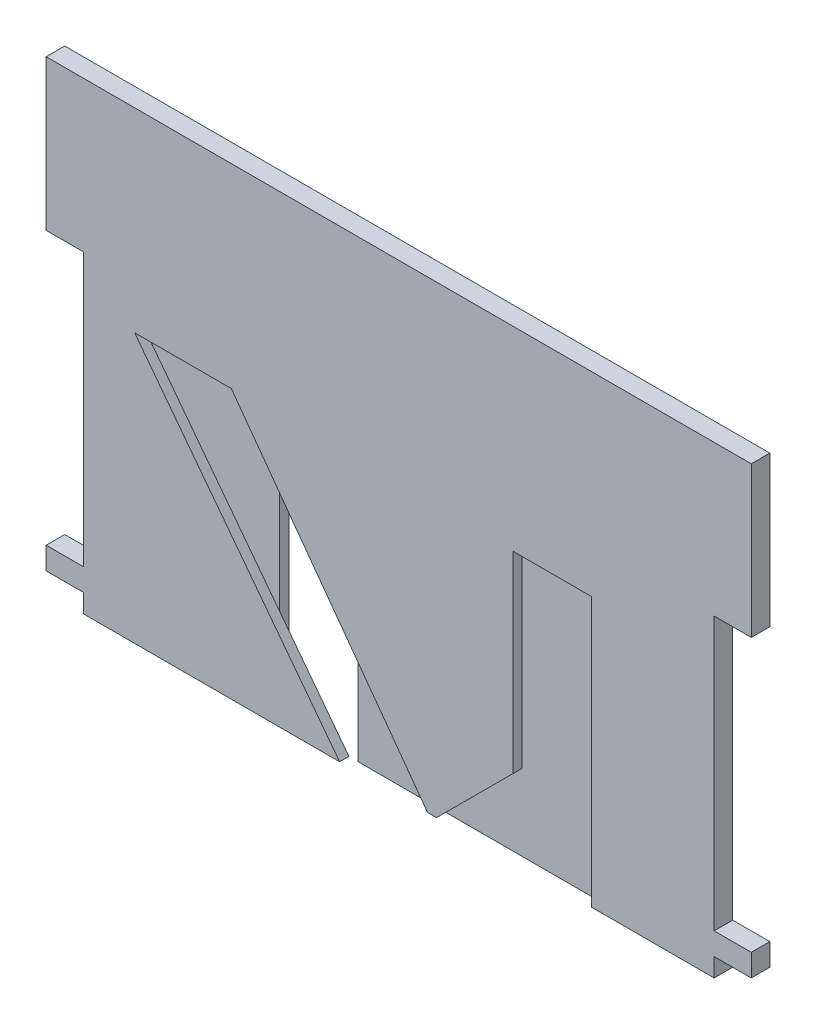
ISO-10303-21;
HEADER;
FILE_DESCRIPTION(('STEP AP214'),'2;1');
FILE_NAME('part.step','',(''),(''),'','','');
FILE_SCHEMA(('AUTOMOTIVE_DESIGN { 1 0 10303 214 1 1 1 1 }'));
ENDSEC;
DATA;
#1=APPLICATION_CONTEXT('core data for automotive mechanical design processes');
#2=APPLICATION_PROTOCOL_DEFINITION('international standard','automotive_design',2000,#1);
#3=PRODUCT_CONTEXT('',#1,'mechanical');
#4=PRODUCT('Part','Part','',(#3));
#5=PRODUCT_RELATED_PRODUCT_CATEGORY('part','',(#4));
#6=PRODUCT_DEFINITION_FORMATION('','',#4);
#7=PRODUCT_DEFINITION_CONTEXT('part definition',#1,'design');
#8=PRODUCT_DEFINITION('design','',#6,#7);
#9=PRODUCT_DEFINITION_SHAPE('','',#8);
#10=(LENGTH_UNIT() NAMED_UNIT(*) SI_UNIT(.MILLI.,.METRE.));
#11=(NAMED_UNIT(*) PLANE_ANGLE_UNIT() SI_UNIT($,.RADIAN.));
#12=(NAMED_UNIT(*) SI_UNIT($,.STERADIAN.) SOLID_ANGLE_UNIT());
#13=UNCERTAINTY_MEASURE_WITH_UNIT(LENGTH_MEASURE(1.E-05),#10,'distance_accuracy_value','');
#14=(GEOMETRIC_REPRESENTATION_CONTEXT(3) GLOBAL_UNCERTAINTY_ASSIGNED_CONTEXT((#13)) GLOBAL_UNIT_ASSIGNED_CONTEXT((#10,
#11,#12)) REPRESENTATION_CONTEXT('',''));
#15=CARTESIAN_POINT('',(0.,0.,0.));
#16=DIRECTION('',(0.,0.,1.));
#17=DIRECTION('',(1.,0.,0.));
#18=AXIS2_PLACEMENT_3D('',#15,#16,#17);
#19=CARTESIAN_POINT('',(7.42992576682308,-12.9952354620521,0.5));
#20=DIRECTION('',(0.,0.,-1.));
#21=DIRECTION('',(-1.,0.,0.));
#22=AXIS2_PLACEMENT_3D('',#19,#20,#21);
#23=PLANE('',#22);
#24=DIRECTION('',(-0.606026720954855,0.795444286854024,0.));
#25=VECTOR('',#24,1.);
#26=CARTESIAN_POINT('',(-0.925480769230772,-2.46394230769231,0.5));
#27=LINE('',#26,#25);
#28=CARTESIAN_POINT('',(-3.18362539043888,0.5,0.5));
#29=VERTEX_POINT('',#28);
#30=CARTESIAN_POINT('',(-6.92307692307691,5.40824126189978,0.5));
#31=VERTEX_POINT('',#30);
#32=EDGE_CURVE('E452',#29,#31,#27,.T.);
#33=ORIENTED_EDGE('',*,*,#32,.F.);
#34=DIRECTION('',(-1.,0.,0.));
#35=VECTOR('',#34,1.);
#36=CARTESIAN_POINT('',(-17.,0.5,0.5));
#37=LINE('',#36,#35);
#38=CARTESIAN_POINT('',(-6.92307692307691,0.5,0.5));
#39=VERTEX_POINT('',#38);
#40=EDGE_CURVE('E257',#29,#39,#37,.T.);
#41=ORIENTED_EDGE('',*,*,#40,.T.);
#42=DIRECTION('',(0.,-1.,0.));
#43=VECTOR('',#42,1.);
#44=CARTESIAN_POINT('',(-6.92307692307691,15.,0.5));
#45=LINE('',#44,#43);
#46=EDGE_CURVE('E408',#31,#39,#45,.T.);
#47=ORIENTED_EDGE('',*,*,#46,.F.);
#48=EDGE_LOOP('',(#33,#41,#47));
#49=FACE_BOUND('',#48,.T.);
#50=ADVANCED_FACE('F39',(#49),#23,.T.);
#51=CARTESIAN_POINT('',(-17.,0.5,1.));
#52=DIRECTION('',(0.,1.,0.));
#53=DIRECTION('',(0.,0.,1.));
#54=AXIS2_PLACEMENT_3D('',#51,#52,#53);
#55=PLANE('',#54);
#56=DIRECTION('',(0.,0.,-1.));
#57=VECTOR('',#56,1.);
#58=CARTESIAN_POINT('',(-3.18362539043888,0.5,1.));
#59=LINE('',#58,#57);
#60=CARTESIAN_POINT('',(-3.18362539043888,0.5,1.));
#61=VERTEX_POINT('',#60);
#62=EDGE_CURVE('E11',#61,#29,#59,.T.);
#63=ORIENTED_EDGE('',*,*,#62,.F.);
#64=DIRECTION('',(1.,0.,0.));
#65=VECTOR('',#64,1.);
#66=CARTESIAN_POINT('',(-17.,0.5,1.));
#67=LINE('',#66,#65);
#68=CARTESIAN_POINT('',(-17.,0.5,1.));
#69=VERTEX_POINT('',#68);
#70=EDGE_CURVE('E226',#69,#61,#67,.T.);
#71=ORIENTED_EDGE('',*,*,#70,.F.);
#72=DIRECTION('',(0.,0.,-1.));
#73=VECTOR('',#72,1.);
#74=CARTESIAN_POINT('',(-17.,0.5,1.));
#75=LINE('',#74,#73);
#76=CARTESIAN_POINT('',(-17.,0.5,0.));
#77=VERTEX_POINT('',#76);
#78=EDGE_CURVE('E275',#69,#77,#75,.T.);
#79=ORIENTED_EDGE('',*,*,#78,.T.);
#80=DIRECTION('',(1.,0.,0.));
#81=VECTOR('',#80,1.);
#82=CARTESIAN_POINT('',(-17.,0.5,0.));
#83=LINE('',#82,#81);
#84=CARTESIAN_POINT('',(-6.92307692307691,0.5,0.));
#85=VERTEX_POINT('',#84);
#86=EDGE_CURVE('E319',#77,#85,#83,.T.);
#87=ORIENTED_EDGE('',*,*,#86,.T.);
#88=DIRECTION('',(0.,0.,-1.));
#89=VECTOR('',#88,1.);
#90=CARTESIAN_POINT('',(-6.92307692307691,0.5,1.));
#91=LINE('',#90,#89);
#92=EDGE_CURVE('E188',#39,#85,#91,.T.);
#93=ORIENTED_EDGE('',*,*,#92,.F.);
#94=ORIENTED_EDGE('',*,*,#40,.F.);
#95=EDGE_LOOP('',(#63,#71,#79,#87,#93,#94));
#96=FACE_BOUND('',#95,.T.);
#97=ADVANCED_FACE('F366',(#96),#55,.F.);
#98=DIRECTION('',(0.,0.,1.));
#99=VECTOR('',#98,1.);
#100=CARTESIAN_POINT('',(10.3846153846154,0.5,1.));
#101=LINE('',#100,#99);
#102=CARTESIAN_POINT('',(10.3846153846154,0.5,0.5));
#103=VERTEX_POINT('',#102);
#104=CARTESIAN_POINT('',(10.3846153846154,0.5,1.));
#105=VERTEX_POINT('',#104);
#106=EDGE_CURVE('E47',#103,#105,#101,.T.);
#107=ORIENTED_EDGE('',*,*,#106,.F.);
#108=DIRECTION('',(-1.,0.,0.));
#109=VECTOR('',#108,1.);
#110=CARTESIAN_POINT('',(-17.,0.5,0.5));
#111=LINE('',#110,#109);
#112=CARTESIAN_POINT('',(2.0328317373461,0.5,0.5));
#113=VERTEX_POINT('',#112);
#114=EDGE_CURVE('E212',#103,#113,#111,.T.);
#115=ORIENTED_EDGE('',*,*,#114,.T.);
#116=DIRECTION('',(0.,0.,-1.));
#117=VECTOR('',#116,1.);
#118=CARTESIAN_POINT('',(2.0328317373461,0.5,1.));
#119=LINE('',#118,#117);
#120=CARTESIAN_POINT('',(2.0328317373461,0.5,1.));
#121=VERTEX_POINT('',#120);
#122=EDGE_CURVE('E265',#121,#113,#119,.T.);
#123=ORIENTED_EDGE('',*,*,#122,.F.);
#124=CARTESIAN_POINT('',(1.55236112631776,0.5,1.));
#125=VERTEX_POINT('',#124);
#126=EDGE_CURVE('E229',#125,#121,#67,.T.);
#127=ORIENTED_EDGE('',*,*,#126,.F.);
#128=DIRECTION('',(0.,0.,1.));
#129=VECTOR('',#128,1.);
#130=CARTESIAN_POINT('',(1.55236112631776,0.5,1.));
#131=LINE('',#130,#129);
#132=CARTESIAN_POINT('',(1.55236112631776,0.5,0.5));
#133=VERTEX_POINT('',#132);
#134=EDGE_CURVE('E259',#133,#125,#131,.T.);
#135=ORIENTED_EDGE('',*,*,#134,.F.);
#136=CARTESIAN_POINT('',(-2.69230769230768,0.5,0.5));
#137=VERTEX_POINT('',#136);
#138=EDGE_CURVE('E214',#133,#137,#111,.T.);
#139=ORIENTED_EDGE('',*,*,#138,.T.);
#140=DIRECTION('',(0.,0.,1.));
#141=VECTOR('',#140,1.);
#142=CARTESIAN_POINT('',(-2.69230769230768,0.5,1.));
#143=LINE('',#142,#141);
#144=CARTESIAN_POINT('',(-2.69230769230768,0.5,0.));
#145=VERTEX_POINT('',#144);
#146=EDGE_CURVE('E315',#145,#137,#143,.T.);
#147=ORIENTED_EDGE('',*,*,#146,.F.);
#148=DIRECTION('',(1.,0.,0.));
#149=VECTOR('',#148,1.);
#150=CARTESIAN_POINT('',(-17.,0.5,0.));
#151=LINE('',#150,#149);
#152=CARTESIAN_POINT('',(17.,0.5,0.));
#153=VERTEX_POINT('',#152);
#154=EDGE_CURVE('E318',#145,#153,#151,.T.);
#155=ORIENTED_EDGE('',*,*,#154,.T.);
#156=DIRECTION('',(0.,0.,-1.));
#157=VECTOR('',#156,1.);
#158=CARTESIAN_POINT('',(17.,0.5,1.));
#159=LINE('',#158,#157);
#160=CARTESIAN_POINT('',(17.,0.5,1.));
#161=VERTEX_POINT('',#160);
#162=EDGE_CURVE('E274',#161,#153,#159,.T.);
#163=ORIENTED_EDGE('',*,*,#162,.F.);
#164=EDGE_CURVE('E224',#105,#161,#67,.T.);
#165=ORIENTED_EDGE('',*,*,#164,.F.);
#166=EDGE_LOOP('',(#107,#115,#123,#127,#135,#139,#147,#155,#163,#165));
#167=FACE_BOUND('',#166,.T.);
#168=ADVANCED_FACE('F373',(#167),#55,.F.);
#169=CARTESIAN_POINT('',(0.,0.,0.));
#170=DIRECTION('',(0.,0.,-1.));
#171=DIRECTION('',(-1.,0.,0.));
#172=AXIS2_PLACEMENT_3D('',#169,#170,#171);
#173=PLANE('',#172);
#174=DIRECTION('',(-1.,0.,0.));
#175=VECTOR('',#174,1.);
#176=CARTESIAN_POINT('',(-2.69230769230768,15.,0.));
#177=LINE('',#176,#175);
#178=CARTESIAN_POINT('',(-2.69230769230768,15.,0.));
#179=VERTEX_POINT('',#178);
#180=CARTESIAN_POINT('',(-6.92307692307691,15.,0.));
#181=VERTEX_POINT('',#180);
#182=EDGE_CURVE('E193',#179,#181,#177,.T.);
#183=ORIENTED_EDGE('',*,*,#182,.T.);
#184=DIRECTION('',(0.,-1.,0.));
#185=VECTOR('',#184,1.);
#186=CARTESIAN_POINT('',(-6.92307692307691,15.,0.));
#187=LINE('',#186,#185);
#188=EDGE_CURVE('E181',#181,#85,#187,.T.);
#189=ORIENTED_EDGE('',*,*,#188,.T.);
#190=ORIENTED_EDGE('',*,*,#86,.F.);
#191=DIRECTION('',(0.,1.,0.));
#192=VECTOR('',#191,1.);
#193=CARTESIAN_POINT('',(-17.,1.5,0.));
#194=LINE('',#193,#192);
#195=CARTESIAN_POINT('',(-17.,1.5,0.));
#196=VERTEX_POINT('',#195);
#197=EDGE_CURVE('E321',#196,#77,#194,.F.);
#198=ORIENTED_EDGE('',*,*,#197,.F.);
#199=DIRECTION('',(-1.,0.,0.));
#200=VECTOR('',#199,1.);
#201=CARTESIAN_POINT('',(-19.,1.5,0.));
#202=LINE('',#201,#200);
#203=CARTESIAN_POINT('',(-19.,1.5,0.));
#204=VERTEX_POINT('',#203);
#205=EDGE_CURVE('E43',#204,#196,#202,.F.);
#206=ORIENTED_EDGE('',*,*,#205,.F.);
#207=DIRECTION('',(0.,1.,0.));
#208=VECTOR('',#207,1.);
#209=CARTESIAN_POINT('',(-19.,2.7,0.));
#210=LINE('',#209,#208);
#211=CARTESIAN_POINT('',(-19.,2.7,0.));
#212=VERTEX_POINT('',#211);
#213=EDGE_CURVE('E123',#212,#204,#210,.F.);
#214=ORIENTED_EDGE('',*,*,#213,.F.);
#215=DIRECTION('',(1.,0.,0.));
#216=VECTOR('',#215,1.);
#217=CARTESIAN_POINT('',(-17.,2.7,0.));
#218=LINE('',#217,#216);
#219=CARTESIAN_POINT('',(-17.,2.7,0.));
#220=VERTEX_POINT('',#219);
#221=EDGE_CURVE('E324',#220,#212,#218,.F.);
#222=ORIENTED_EDGE('',*,*,#221,.F.);
#223=DIRECTION('',(0.,1.,0.));
#224=VECTOR('',#223,1.);
#225=CARTESIAN_POINT('',(-17.,17.3947217067352,0.));
#226=LINE('',#225,#224);
#227=CARTESIAN_POINT('',(-17.,17.3947217067352,0.));
#228=VERTEX_POINT('',#227);
#229=EDGE_CURVE('E330',#228,#220,#226,.F.);
#230=ORIENTED_EDGE('',*,*,#229,.F.);
#231=DIRECTION('',(1.,0.,0.));
#232=VECTOR('',#231,1.);
#233=CARTESIAN_POINT('',(-19.,17.3947217067352,0.));
#234=LINE('',#233,#232);
#235=CARTESIAN_POINT('',(-19.,17.3947217067352,0.));
#236=VERTEX_POINT('',#235);
#237=EDGE_CURVE('E326',#236,#228,#234,.T.);
#238=ORIENTED_EDGE('',*,*,#237,.F.);
#239=DIRECTION('',(0.,1.,0.));
#240=VECTOR('',#239,1.);
#241=CARTESIAN_POINT('',(-19.,25.5,0.));
#242=LINE('',#241,#240);
#243=CARTESIAN_POINT('',(-19.,25.5,0.));
#244=VERTEX_POINT('',#243);
#245=EDGE_CURVE('E332',#244,#236,#242,.F.);
#246=ORIENTED_EDGE('',*,*,#245,.F.);
#247=DIRECTION('',(1.,0.,0.));
#248=VECTOR('',#247,1.);
#249=CARTESIAN_POINT('',(19.,25.5,0.));
#250=LINE('',#249,#248);
#251=CARTESIAN_POINT('',(19.,25.5,0.));
#252=VERTEX_POINT('',#251);
#253=EDGE_CURVE('E335',#252,#244,#250,.F.);
#254=ORIENTED_EDGE('',*,*,#253,.F.);
#255=DIRECTION('',(0.,1.,0.));
#256=VECTOR('',#255,1.);
#257=CARTESIAN_POINT('',(19.,17.3947217067352,0.));
#258=LINE('',#257,#256);
#259=CARTESIAN_POINT('',(19.,17.3947217067352,0.));
#260=VERTEX_POINT('',#259);
#261=EDGE_CURVE('E333',#260,#252,#258,.T.);
#262=ORIENTED_EDGE('',*,*,#261,.F.);
#263=DIRECTION('',(1.,0.,0.));
#264=VECTOR('',#263,1.);
#265=CARTESIAN_POINT('',(17.,17.3947217067352,0.));
#266=LINE('',#265,#264);
#267=CARTESIAN_POINT('',(17.,17.3947217067352,0.));
#268=VERTEX_POINT('',#267);
#269=EDGE_CURVE('E340',#268,#260,#266,.T.);
#270=ORIENTED_EDGE('',*,*,#269,.F.);
#271=DIRECTION('',(0.,1.,0.));
#272=VECTOR('',#271,1.);
#273=CARTESIAN_POINT('',(17.,2.7,0.));
#274=LINE('',#273,#272);
#275=CARTESIAN_POINT('',(17.,2.7,0.));
#276=VERTEX_POINT('',#275);
#277=EDGE_CURVE('E339',#276,#268,#274,.T.);
#278=ORIENTED_EDGE('',*,*,#277,.F.);
#279=DIRECTION('',(1.,0.,0.));
#280=VECTOR('',#279,1.);
#281=CARTESIAN_POINT('',(19.,2.7,0.));
#282=LINE('',#281,#280);
#283=CARTESIAN_POINT('',(19.,2.7,0.));
#284=VERTEX_POINT('',#283);
#285=EDGE_CURVE('E342',#284,#276,#282,.F.);
#286=ORIENTED_EDGE('',*,*,#285,.F.);
#287=DIRECTION('',(0.,1.,0.));
#288=VECTOR('',#287,1.);
#289=CARTESIAN_POINT('',(19.,1.5,0.));
#290=LINE('',#289,#288);
#291=CARTESIAN_POINT('',(19.,1.5,0.));
#292=VERTEX_POINT('',#291);
#293=EDGE_CURVE('E345',#292,#284,#290,.T.);
#294=ORIENTED_EDGE('',*,*,#293,.F.);
#295=DIRECTION('',(-1.,0.,0.));
#296=VECTOR('',#295,1.);
#297=CARTESIAN_POINT('',(17.,1.5,0.));
#298=LINE('',#297,#296);
#299=CARTESIAN_POINT('',(17.,1.5,0.));
#300=VERTEX_POINT('',#299);
#301=EDGE_CURVE('E343',#300,#292,#298,.F.);
#302=ORIENTED_EDGE('',*,*,#301,.F.);
#303=DIRECTION('',(0.,1.,0.));
#304=VECTOR('',#303,1.);
#305=CARTESIAN_POINT('',(17.,0.5,0.));
#306=LINE('',#305,#304);
#307=EDGE_CURVE('E322',#153,#300,#306,.T.);
#308=ORIENTED_EDGE('',*,*,#307,.F.);
#309=ORIENTED_EDGE('',*,*,#154,.F.);
#310=DIRECTION('',(0.,1.,0.));
#311=VECTOR('',#310,1.);
#312=CARTESIAN_POINT('',(-2.69230769230768,-5.63100961538462,0.));
#313=LINE('',#312,#311);
#314=EDGE_CURVE('E213',#145,#179,#313,.T.);
#315=ORIENTED_EDGE('',*,*,#314,.T.);
#316=EDGE_LOOP('',(#183,#189,#190,#198,#206,#214,#222,#230,#238,#246,#254,#262,#270,#278,#286,
#294,#302,#308,#309,#315));
#317=FACE_BOUND('',#316,.T.);
#318=ADVANCED_FACE('F206',(#317),#173,.T.);
#319=CARTESIAN_POINT('',(-19.,1.5,1.));
#320=DIRECTION('',(0.,1.,0.));
#321=DIRECTION('',(-1.,0.,0.));
#322=AXIS2_PLACEMENT_3D('',#319,#320,#321);
#323=PLANE('',#322);
#324=ORIENTED_EDGE('',*,*,#205,.T.);
#325=DIRECTION('',(0.,0.,-1.));
#326=VECTOR('',#325,1.);
#327=CARTESIAN_POINT('',(-17.,1.5,1.));
#328=LINE('',#327,#326);
#329=CARTESIAN_POINT('',(-17.,1.5,1.));
#330=VERTEX_POINT('',#329);
#331=EDGE_CURVE('E269',#330,#196,#328,.T.);
#332=ORIENTED_EDGE('',*,*,#331,.F.);
#333=DIRECTION('',(1.,0.,0.));
#334=VECTOR('',#333,1.);
#335=CARTESIAN_POINT('',(-19.,1.5,1.));
#336=LINE('',#335,#334);
#337=CARTESIAN_POINT('',(-19.,1.5,1.));
#338=VERTEX_POINT('',#337);
#339=EDGE_CURVE('E225',#338,#330,#336,.T.);
#340=ORIENTED_EDGE('',*,*,#339,.F.);
#341=DIRECTION('',(0.,0.,-1.));
#342=VECTOR('',#341,1.);
#343=CARTESIAN_POINT('',(-19.,1.5,1.));
#344=LINE('',#343,#342);
#345=EDGE_CURVE('E258',#338,#204,#344,.T.);
#346=ORIENTED_EDGE('',*,*,#345,.T.);
#347=EDGE_LOOP('',(#324,#332,#340,#346));
#348=FACE_BOUND('',#347,.T.);
#349=ADVANCED_FACE('F41',(#348),#323,.F.);
#350=CARTESIAN_POINT('',(-17.,1.5,1.));
#351=DIRECTION('',(1.,0.,0.));
#352=DIRECTION('',(0.,0.,-1.));
#353=AXIS2_PLACEMENT_3D('',#350,#351,#352);
#354=PLANE('',#353);
#355=ORIENTED_EDGE('',*,*,#197,.T.);
#356=ORIENTED_EDGE('',*,*,#78,.F.);
#357=DIRECTION('',(0.,-1.,0.));
#358=VECTOR('',#357,1.);
#359=CARTESIAN_POINT('',(-17.,1.5,1.));
#360=LINE('',#359,#358);
#361=EDGE_CURVE('E127',#330,#69,#360,.T.);
#362=ORIENTED_EDGE('',*,*,#361,.F.);
#363=ORIENTED_EDGE('',*,*,#331,.T.);
#364=EDGE_LOOP('',(#355,#356,#362,#363));
#365=FACE_BOUND('',#364,.T.);
#366=ADVANCED_FACE('F354',(#365),#354,.F.);
#367=CARTESIAN_POINT('',(17.,0.5,1.));
#368=DIRECTION('',(-1.,0.,0.));
#369=DIRECTION('',(0.,0.,1.));
#370=AXIS2_PLACEMENT_3D('',#367,#368,#369);
#371=PLANE('',#370);
#372=ORIENTED_EDGE('',*,*,#307,.T.);
#373=DIRECTION('',(0.,0.,-1.));
#374=VECTOR('',#373,1.);
#375=CARTESIAN_POINT('',(17.,1.5,1.));
#376=LINE('',#375,#374);
#377=CARTESIAN_POINT('',(17.,1.5,1.));
#378=VERTEX_POINT('',#377);
#379=EDGE_CURVE('E277',#378,#300,#376,.T.);
#380=ORIENTED_EDGE('',*,*,#379,.F.);
#381=DIRECTION('',(0.,1.,0.));
#382=VECTOR('',#381,1.);
#383=CARTESIAN_POINT('',(17.,0.5,1.));
#384=LINE('',#383,#382);
#385=EDGE_CURVE('E227',#161,#378,#384,.T.);
#386=ORIENTED_EDGE('',*,*,#385,.F.);
#387=ORIENTED_EDGE('',*,*,#162,.T.);
#388=EDGE_LOOP('',(#372,#380,#386,#387));
#389=FACE_BOUND('',#388,.T.);
#390=ADVANCED_FACE('F356',(#389),#371,.F.);
#391=CARTESIAN_POINT('',(17.,1.5,1.));
#392=DIRECTION('',(0.,1.,0.));
#393=DIRECTION('',(-1.,0.,0.));
#394=AXIS2_PLACEMENT_3D('',#391,#392,#393);
#395=PLANE('',#394);
#396=ORIENTED_EDGE('',*,*,#301,.T.);
#397=DIRECTION('',(0.,0.,-1.));
#398=VECTOR('',#397,1.);
#399=CARTESIAN_POINT('',(19.,1.5,1.));
#400=LINE('',#399,#398);
#401=CARTESIAN_POINT('',(19.,1.5,1.));
#402=VERTEX_POINT('',#401);
#403=EDGE_CURVE('E282',#402,#292,#400,.T.);
#404=ORIENTED_EDGE('',*,*,#403,.F.);
#405=DIRECTION('',(1.,0.,0.));
#406=VECTOR('',#405,1.);
#407=CARTESIAN_POINT('',(17.,1.5,1.));
#408=LINE('',#407,#406);
#409=EDGE_CURVE('E235',#378,#402,#408,.T.);
#410=ORIENTED_EDGE('',*,*,#409,.F.);
#411=ORIENTED_EDGE('',*,*,#379,.T.);
#412=EDGE_LOOP('',(#396,#404,#410,#411));
#413=FACE_BOUND('',#412,.T.);
#414=ADVANCED_FACE('F361',(#413),#395,.F.);
#415=CARTESIAN_POINT('',(19.,1.5,1.));
#416=DIRECTION('',(-1.,0.,0.));
#417=DIRECTION('',(0.,0.,1.));
#418=AXIS2_PLACEMENT_3D('',#415,#416,#417);
#419=PLANE('',#418);
#420=ORIENTED_EDGE('',*,*,#293,.T.);
#421=DIRECTION('',(0.,0.,-1.));
#422=VECTOR('',#421,1.);
#423=CARTESIAN_POINT('',(19.,2.7,1.));
#424=LINE('',#423,#422);
#425=CARTESIAN_POINT('',(19.,2.7,1.));
#426=VERTEX_POINT('',#425);
#427=EDGE_CURVE('E281',#426,#284,#424,.T.);
#428=ORIENTED_EDGE('',*,*,#427,.F.);
#429=DIRECTION('',(0.,1.,0.));
#430=VECTOR('',#429,1.);
#431=CARTESIAN_POINT('',(19.,1.5,1.));
#432=LINE('',#431,#430);
#433=EDGE_CURVE('E233',#402,#426,#432,.T.);
#434=ORIENTED_EDGE('',*,*,#433,.F.);
#435=ORIENTED_EDGE('',*,*,#403,.T.);
#436=EDGE_LOOP('',(#420,#428,#434,#435));
#437=FACE_BOUND('',#436,.T.);
#438=ADVANCED_FACE('F533',(#437),#419,.F.);
#439=CARTESIAN_POINT('',(19.,2.7,1.));
#440=DIRECTION('',(0.,-1.,0.));
#441=DIRECTION('',(0.,0.,-1.));
#442=AXIS2_PLACEMENT_3D('',#439,#440,#441);
#443=PLANE('',#442);
#444=ORIENTED_EDGE('',*,*,#285,.T.);
#445=DIRECTION('',(0.,0.,-1.));
#446=VECTOR('',#445,1.);
#447=CARTESIAN_POINT('',(17.,2.7,1.));
#448=LINE('',#447,#446);
#449=CARTESIAN_POINT('',(17.,2.7,1.));
#450=VERTEX_POINT('',#449);
#451=EDGE_CURVE('E289',#450,#276,#448,.T.);
#452=ORIENTED_EDGE('',*,*,#451,.F.);
#453=DIRECTION('',(-1.,0.,0.));
#454=VECTOR('',#453,1.);
#455=CARTESIAN_POINT('',(19.,2.7,1.));
#456=LINE('',#455,#454);
#457=EDGE_CURVE('E237',#426,#450,#456,.T.);
#458=ORIENTED_EDGE('',*,*,#457,.F.);
#459=ORIENTED_EDGE('',*,*,#427,.T.);
#460=EDGE_LOOP('',(#444,#452,#458,#459));
#461=FACE_BOUND('',#460,.T.);
#462=ADVANCED_FACE('F534',(#461),#443,.F.);
#463=CARTESIAN_POINT('',(17.,2.7,1.));
#464=DIRECTION('',(-1.,0.,0.));
#465=DIRECTION('',(0.,0.,1.));
#466=AXIS2_PLACEMENT_3D('',#463,#464,#465);
#467=PLANE('',#466);
#468=ORIENTED_EDGE('',*,*,#277,.T.);
#469=DIRECTION('',(0.,0.,-1.));
#470=VECTOR('',#469,1.);
#471=CARTESIAN_POINT('',(17.,17.3947217067352,1.));
#472=LINE('',#471,#470);
#473=CARTESIAN_POINT('',(17.,17.3947217067352,1.));
#474=VERTEX_POINT('',#473);
#475=EDGE_CURVE('E288',#474,#268,#472,.T.);
#476=ORIENTED_EDGE('',*,*,#475,.F.);
#477=DIRECTION('',(0.,1.,0.));
#478=VECTOR('',#477,1.);
#479=CARTESIAN_POINT('',(17.,2.7,1.));
#480=LINE('',#479,#478);
#481=EDGE_CURVE('E239',#450,#474,#480,.T.);
#482=ORIENTED_EDGE('',*,*,#481,.F.);
#483=ORIENTED_EDGE('',*,*,#451,.T.);
#484=EDGE_LOOP('',(#468,#476,#482,#483));
#485=FACE_BOUND('',#484,.T.);
#486=ADVANCED_FACE('F537',(#485),#467,.F.);
#487=CARTESIAN_POINT('',(17.,17.3947217067352,1.));
#488=DIRECTION('',(0.,1.,0.));
#489=DIRECTION('',(0.,0.,1.));
#490=AXIS2_PLACEMENT_3D('',#487,#488,#489);
#491=PLANE('',#490);
#492=ORIENTED_EDGE('',*,*,#269,.T.);
#493=DIRECTION('',(0.,0.,-1.));
#494=VECTOR('',#493,1.);
#495=CARTESIAN_POINT('',(19.,17.3947217067352,1.));
#496=LINE('',#495,#494);
#497=CARTESIAN_POINT('',(19.,17.3947217067352,1.));
#498=VERTEX_POINT('',#497);
#499=EDGE_CURVE('E291',#498,#260,#496,.T.);
#500=ORIENTED_EDGE('',*,*,#499,.F.);
#501=DIRECTION('',(1.,0.,0.));
#502=VECTOR('',#501,1.);
#503=CARTESIAN_POINT('',(17.,17.3947217067352,1.));
#504=LINE('',#503,#502);
#505=EDGE_CURVE('E238',#474,#498,#504,.T.);
#506=ORIENTED_EDGE('',*,*,#505,.F.);
#507=ORIENTED_EDGE('',*,*,#475,.T.);
#508=EDGE_LOOP('',(#492,#500,#506,#507));
#509=FACE_BOUND('',#508,.T.);
#510=ADVANCED_FACE('F544',(#509),#491,.F.);
#511=CARTESIAN_POINT('',(19.,17.3947217067352,1.));
#512=DIRECTION('',(-1.,0.,0.));
#513=DIRECTION('',(0.,0.,1.));
#514=AXIS2_PLACEMENT_3D('',#511,#512,#513);
#515=PLANE('',#514);
#516=ORIENTED_EDGE('',*,*,#261,.T.);
#517=DIRECTION('',(0.,0.,-1.));
#518=VECTOR('',#517,1.);
#519=CARTESIAN_POINT('',(19.,25.5,1.));
#520=LINE('',#519,#518);
#521=CARTESIAN_POINT('',(19.,25.5,1.));
#522=VERTEX_POINT('',#521);
#523=EDGE_CURVE('E297',#522,#252,#520,.T.);
#524=ORIENTED_EDGE('',*,*,#523,.F.);
#525=DIRECTION('',(0.,1.,0.));
#526=VECTOR('',#525,1.);
#527=CARTESIAN_POINT('',(19.,17.3947217067352,1.));
#528=LINE('',#527,#526);
#529=EDGE_CURVE('E244',#498,#522,#528,.T.);
#530=ORIENTED_EDGE('',*,*,#529,.F.);
#531=ORIENTED_EDGE('',*,*,#499,.T.);
#532=EDGE_LOOP('',(#516,#524,#530,#531));
#533=FACE_BOUND('',#532,.T.);
#534=ADVANCED_FACE('F548',(#533),#515,.F.);
#535=CARTESIAN_POINT('',(19.,25.5,1.));
#536=DIRECTION('',(0.,-1.,0.));
#537=DIRECTION('',(0.,0.,-1.));
#538=AXIS2_PLACEMENT_3D('',#535,#536,#537);
#539=PLANE('',#538);
#540=ORIENTED_EDGE('',*,*,#253,.T.);
#541=DIRECTION('',(0.,0.,-1.));
#542=VECTOR('',#541,1.);
#543=CARTESIAN_POINT('',(-19.,25.5,1.));
#544=LINE('',#543,#542);
#545=CARTESIAN_POINT('',(-19.,25.5,1.));
#546=VERTEX_POINT('',#545);
#547=EDGE_CURVE('E296',#546,#244,#544,.T.);
#548=ORIENTED_EDGE('',*,*,#547,.F.);
#549=DIRECTION('',(-1.,0.,0.));
#550=VECTOR('',#549,1.);
#551=CARTESIAN_POINT('',(19.,25.5,1.));
#552=LINE('',#551,#550);
#553=EDGE_CURVE('E241',#522,#546,#552,.T.);
#554=ORIENTED_EDGE('',*,*,#553,.F.);
#555=ORIENTED_EDGE('',*,*,#523,.T.);
#556=EDGE_LOOP('',(#540,#548,#554,#555));
#557=FACE_BOUND('',#556,.T.);
#558=ADVANCED_FACE('F551',(#557),#539,.F.);
#559=CARTESIAN_POINT('',(-19.,25.5,1.));
#560=DIRECTION('',(1.,0.,0.));
#561=DIRECTION('',(0.,0.,-1.));
#562=AXIS2_PLACEMENT_3D('',#559,#560,#561);
#563=PLANE('',#562);
#564=ORIENTED_EDGE('',*,*,#245,.T.);
#565=DIRECTION('',(0.,0.,-1.));
#566=VECTOR('',#565,1.);
#567=CARTESIAN_POINT('',(-19.,17.3947217067352,1.));
#568=LINE('',#567,#566);
#569=CARTESIAN_POINT('',(-19.,17.3947217067352,1.));
#570=VERTEX_POINT('',#569);
#571=EDGE_CURVE('E302',#570,#236,#568,.T.);
#572=ORIENTED_EDGE('',*,*,#571,.F.);
#573=DIRECTION('',(0.,-1.,0.));
#574=VECTOR('',#573,1.);
#575=CARTESIAN_POINT('',(-19.,25.5,1.));
#576=LINE('',#575,#574);
#577=EDGE_CURVE('E247',#546,#570,#576,.T.);
#578=ORIENTED_EDGE('',*,*,#577,.F.);
#579=ORIENTED_EDGE('',*,*,#547,.T.);
#580=EDGE_LOOP('',(#564,#572,#578,#579));
#581=FACE_BOUND('',#580,.T.);
#582=ADVANCED_FACE('F558',(#581),#563,.F.);
#583=CARTESIAN_POINT('',(-19.,17.3947217067352,1.));
#584=DIRECTION('',(0.,1.,0.));
#585=DIRECTION('',(0.,0.,1.));
#586=AXIS2_PLACEMENT_3D('',#583,#584,#585);
#587=PLANE('',#586);
#588=ORIENTED_EDGE('',*,*,#237,.T.);
#589=DIRECTION('',(0.,0.,-1.));
#590=VECTOR('',#589,1.);
#591=CARTESIAN_POINT('',(-17.,17.3947217067352,1.));
#592=LINE('',#591,#590);
#593=CARTESIAN_POINT('',(-17.,17.3947217067352,1.));
#594=VERTEX_POINT('',#593);
#595=EDGE_CURVE('E304',#594,#228,#592,.T.);
#596=ORIENTED_EDGE('',*,*,#595,.F.);
#597=DIRECTION('',(1.,0.,0.));
#598=VECTOR('',#597,1.);
#599=CARTESIAN_POINT('',(-19.,17.3947217067352,1.));
#600=LINE('',#599,#598);
#601=EDGE_CURVE('E246',#570,#594,#600,.T.);
#602=ORIENTED_EDGE('',*,*,#601,.F.);
#603=ORIENTED_EDGE('',*,*,#571,.T.);
#604=EDGE_LOOP('',(#588,#596,#602,#603));
#605=FACE_BOUND('',#604,.T.);
#606=ADVANCED_FACE('F564',(#605),#587,.F.);
#607=CARTESIAN_POINT('',(-17.,17.3947217067352,1.));
#608=DIRECTION('',(1.,0.,0.));
#609=DIRECTION('',(0.,0.,-1.));
#610=AXIS2_PLACEMENT_3D('',#607,#608,#609);
#611=PLANE('',#610);
#612=ORIENTED_EDGE('',*,*,#229,.T.);
#613=DIRECTION('',(0.,0.,-1.));
#614=VECTOR('',#613,1.);
#615=CARTESIAN_POINT('',(-17.,2.7,1.));
#616=LINE('',#615,#614);
#617=CARTESIAN_POINT('',(-17.,2.7,1.));
#618=VERTEX_POINT('',#617);
#619=EDGE_CURVE('E306',#618,#220,#616,.T.);
#620=ORIENTED_EDGE('',*,*,#619,.F.);
#621=DIRECTION('',(0.,-1.,0.));
#622=VECTOR('',#621,1.);
#623=CARTESIAN_POINT('',(-17.,17.3947217067352,1.));
#624=LINE('',#623,#622);
#625=EDGE_CURVE('E248',#594,#618,#624,.T.);
#626=ORIENTED_EDGE('',*,*,#625,.F.);
#627=ORIENTED_EDGE('',*,*,#595,.T.);
#628=EDGE_LOOP('',(#612,#620,#626,#627));
#629=FACE_BOUND('',#628,.T.);
#630=ADVANCED_FACE('F566',(#629),#611,.F.);
#631=CARTESIAN_POINT('',(-17.,2.7,1.));
#632=DIRECTION('',(0.,-1.,0.));
#633=DIRECTION('',(0.,0.,-1.));
#634=AXIS2_PLACEMENT_3D('',#631,#632,#633);
#635=PLANE('',#634);
#636=ORIENTED_EDGE('',*,*,#221,.T.);
#637=DIRECTION('',(0.,0.,-1.));
#638=VECTOR('',#637,1.);
#639=CARTESIAN_POINT('',(-19.,2.7,1.));
#640=LINE('',#639,#638);
#641=CARTESIAN_POINT('',(-19.,2.7,1.));
#642=VERTEX_POINT('',#641);
#643=EDGE_CURVE('E267',#642,#212,#640,.T.);
#644=ORIENTED_EDGE('',*,*,#643,.F.);
#645=DIRECTION('',(-1.,0.,0.));
#646=VECTOR('',#645,1.);
#647=CARTESIAN_POINT('',(-17.,2.7,1.));
#648=LINE('',#647,#646);
#649=EDGE_CURVE('E254',#618,#642,#648,.T.);
#650=ORIENTED_EDGE('',*,*,#649,.F.);
#651=ORIENTED_EDGE('',*,*,#619,.T.);
#652=EDGE_LOOP('',(#636,#644,#650,#651));
#653=FACE_BOUND('',#652,.T.);
#654=ADVANCED_FACE('F575',(#653),#635,.F.);
#655=CARTESIAN_POINT('',(-19.,2.7,1.));
#656=DIRECTION('',(1.,0.,0.));
#657=DIRECTION('',(0.,0.,-1.));
#658=AXIS2_PLACEMENT_3D('',#655,#656,#657);
#659=PLANE('',#658);
#660=ORIENTED_EDGE('',*,*,#213,.T.);
#661=ORIENTED_EDGE('',*,*,#345,.F.);
#662=DIRECTION('',(0.,-1.,0.));
#663=VECTOR('',#662,1.);
#664=CARTESIAN_POINT('',(-19.,2.7,1.));
#665=LINE('',#664,#663);
#666=EDGE_CURVE('E251',#642,#338,#665,.T.);
#667=ORIENTED_EDGE('',*,*,#666,.F.);
#668=ORIENTED_EDGE('',*,*,#643,.T.);
#669=EDGE_LOOP('',(#660,#661,#667,#668));
#670=FACE_BOUND('',#669,.T.);
#671=ADVANCED_FACE('F574',(#670),#659,.F.);
#672=CARTESIAN_POINT('',(0.,0.,1.));
#673=DIRECTION('',(0.,0.,-1.));
#674=DIRECTION('',(-1.,0.,0.));
#675=AXIS2_PLACEMENT_3D('',#672,#673,#674);
#676=PLANE('',#675);
#677=DIRECTION('',(1.,0.,0.));
#678=VECTOR('',#677,1.);
#679=CARTESIAN_POINT('',(-14.2307692307692,15.,1.));
#680=LINE('',#679,#678);
#681=CARTESIAN_POINT('',(-14.2307692307692,15.,1.));
#682=VERTEX_POINT('',#681);
#683=CARTESIAN_POINT('',(-9.02043269230769,15.,1.));
#684=VERTEX_POINT('',#683);
#685=EDGE_CURVE('E433',#682,#684,#680,.T.);
#686=ORIENTED_EDGE('',*,*,#685,.T.);
#687=DIRECTION('',(0.589167688050869,-0.808010789133903,0.));
#688=VECTOR('',#687,1.);
#689=CARTESIAN_POINT('',(-9.02043269230769,15.,1.));
#690=LINE('',#689,#688);
#691=EDGE_CURVE('E59',#684,#125,#690,.T.);
#692=ORIENTED_EDGE('',*,*,#691,.T.);
#693=ORIENTED_EDGE('',*,*,#126,.T.);
#694=DIRECTION('',(0.707589942466657,0.70662328953979,0.));
#695=VECTOR('',#694,1.);
#696=CARTESIAN_POINT('',(1.75480769230769,0.222355769230768,1.));
#697=LINE('',#696,#695);
#698=CARTESIAN_POINT('',(6.15384615384615,4.61538461538461,1.));
#699=VERTEX_POINT('',#698);
#700=EDGE_CURVE('E320',#121,#699,#697,.T.);
#701=ORIENTED_EDGE('',*,*,#700,.T.);
#702=DIRECTION('',(0.,1.,0.));
#703=VECTOR('',#702,1.);
#704=CARTESIAN_POINT('',(6.15384615384615,4.61538461538461,1.));
#705=LINE('',#704,#703);
#706=CARTESIAN_POINT('',(6.15384615384615,15.,1.));
#707=VERTEX_POINT('',#706);
#708=EDGE_CURVE('E426',#699,#707,#705,.T.);
#709=ORIENTED_EDGE('',*,*,#708,.T.);
#710=DIRECTION('',(1.,0.,0.));
#711=VECTOR('',#710,1.);
#712=CARTESIAN_POINT('',(6.15384615384615,15.,1.));
#713=LINE('',#712,#711);
#714=CARTESIAN_POINT('',(10.3846153846154,15.,1.));
#715=VERTEX_POINT('',#714);
#716=EDGE_CURVE('E441',#707,#715,#713,.T.);
#717=ORIENTED_EDGE('',*,*,#716,.T.);
#718=DIRECTION('',(0.,-1.,0.));
#719=VECTOR('',#718,1.);
#720=CARTESIAN_POINT('',(10.3846153846154,15.,1.));
#721=LINE('',#720,#719);
#722=EDGE_CURVE('E436',#715,#105,#721,.T.);
#723=ORIENTED_EDGE('',*,*,#722,.T.);
#724=ORIENTED_EDGE('',*,*,#164,.T.);
#725=ORIENTED_EDGE('',*,*,#385,.T.);
#726=ORIENTED_EDGE('',*,*,#409,.T.);
#727=ORIENTED_EDGE('',*,*,#433,.T.);
#728=ORIENTED_EDGE('',*,*,#457,.T.);
#729=ORIENTED_EDGE('',*,*,#481,.T.);
#730=ORIENTED_EDGE('',*,*,#505,.T.);
#731=ORIENTED_EDGE('',*,*,#529,.T.);
#732=ORIENTED_EDGE('',*,*,#553,.T.);
#733=ORIENTED_EDGE('',*,*,#577,.T.);
#734=ORIENTED_EDGE('',*,*,#601,.T.);
#735=ORIENTED_EDGE('',*,*,#625,.T.);
#736=ORIENTED_EDGE('',*,*,#649,.T.);
#737=ORIENTED_EDGE('',*,*,#666,.T.);
#738=ORIENTED_EDGE('',*,*,#339,.T.);
#739=ORIENTED_EDGE('',*,*,#361,.T.);
#740=ORIENTED_EDGE('',*,*,#70,.T.);
#741=DIRECTION('',(-0.606026720954855,0.795444286854024,0.));
#742=VECTOR('',#741,1.);
#743=CARTESIAN_POINT('',(-0.925480769230772,-2.46394230769231,1.));
#744=LINE('',#743,#742);
#745=EDGE_CURVE('E261',#61,#682,#744,.T.);
#746=ORIENTED_EDGE('',*,*,#745,.T.);
#747=EDGE_LOOP('',(#686,#692,#693,#701,#709,#717,#723,#724,#725,#726,#727,#728,#729,#730,#731,
#732,#733,#734,#735,#736,#737,#738,#739,#740,#746));
#748=FACE_BOUND('',#747,.T.);
#749=ADVANCED_FACE('F488',(#748),#676,.F.);
#750=CARTESIAN_POINT('',(-2.69230769230768,-5.63100961538462,0.5));
#751=DIRECTION('',(-1.,0.,0.));
#752=DIRECTION('',(0.,0.,1.));
#753=AXIS2_PLACEMENT_3D('',#750,#751,#752);
#754=PLANE('',#753);
#755=ORIENTED_EDGE('',*,*,#146,.T.);
#756=DIRECTION('',(0.,1.,0.));
#757=VECTOR('',#756,1.);
#758=CARTESIAN_POINT('',(-2.69230769230768,-5.63100961538462,0.5));
#759=LINE('',#758,#757);
#760=CARTESIAN_POINT('',(-2.69230769230768,6.32132773284995,0.5));
#761=VERTEX_POINT('',#760);
#762=EDGE_CURVE('E409',#137,#761,#759,.T.);
#763=ORIENTED_EDGE('',*,*,#762,.T.);
#764=CARTESIAN_POINT('',(-2.69230769230768,15.,0.5));
#765=VERTEX_POINT('',#764);
#766=EDGE_CURVE('E191',#761,#765,#759,.T.);
#767=ORIENTED_EDGE('',*,*,#766,.T.);
#768=DIRECTION('',(0.,0.,-1.));
#769=VECTOR('',#768,1.);
#770=CARTESIAN_POINT('',(-2.69230769230768,15.,0.5));
#771=LINE('',#770,#769);
#772=EDGE_CURVE('E207',#765,#179,#771,.T.);
#773=ORIENTED_EDGE('',*,*,#772,.T.);
#774=ORIENTED_EDGE('',*,*,#314,.F.);
#775=EDGE_LOOP('',(#755,#763,#767,#773,#774));
#776=FACE_BOUND('',#775,.T.);
#777=ADVANCED_FACE('F386',(#776),#754,.T.);
#778=CARTESIAN_POINT('',(-6.92307692307691,15.,0.5));
#779=DIRECTION('',(1.,0.,0.));
#780=DIRECTION('',(0.,0.,-1.));
#781=AXIS2_PLACEMENT_3D('',#778,#779,#780);
#782=PLANE('',#781);
#783=ORIENTED_EDGE('',*,*,#92,.T.);
#784=ORIENTED_EDGE('',*,*,#188,.F.);
#785=DIRECTION('',(0.,0.,-1.));
#786=VECTOR('',#785,1.);
#787=CARTESIAN_POINT('',(-6.92307692307691,15.,0.5));
#788=LINE('',#787,#786);
#789=CARTESIAN_POINT('',(-6.92307692307691,15.,0.5));
#790=VERTEX_POINT('',#789);
#791=EDGE_CURVE('E184',#790,#181,#788,.T.);
#792=ORIENTED_EDGE('',*,*,#791,.F.);
#793=CARTESIAN_POINT('',(-6.92307692307691,12.1235929522931,0.5));
#794=VERTEX_POINT('',#793);
#795=EDGE_CURVE('E209',#790,#794,#45,.T.);
#796=ORIENTED_EDGE('',*,*,#795,.T.);
#797=EDGE_CURVE('E410',#794,#31,#45,.T.);
#798=ORIENTED_EDGE('',*,*,#797,.T.);
#799=ORIENTED_EDGE('',*,*,#46,.T.);
#800=EDGE_LOOP('',(#783,#784,#792,#796,#798,#799));
#801=FACE_BOUND('',#800,.T.);
#802=ADVANCED_FACE('F183',(#801),#782,.T.);
#803=DIRECTION('',(0.589167688050869,-0.808010789133903,0.));
#804=VECTOR('',#803,1.);
#805=CARTESIAN_POINT('',(-9.02043269230769,15.,0.5));
#806=LINE('',#805,#804);
#807=EDGE_CURVE('E395',#794,#761,#806,.T.);
#808=ORIENTED_EDGE('',*,*,#807,.F.);
#809=ORIENTED_EDGE('',*,*,#795,.F.);
#810=DIRECTION('',(-1.,0.,0.));
#811=VECTOR('',#810,1.);
#812=CARTESIAN_POINT('',(-2.69230769230768,15.,0.5));
#813=LINE('',#812,#811);
#814=EDGE_CURVE('E203',#765,#790,#813,.T.);
#815=ORIENTED_EDGE('',*,*,#814,.F.);
#816=ORIENTED_EDGE('',*,*,#766,.F.);
#817=EDGE_LOOP('',(#808,#809,#815,#816));
#818=FACE_BOUND('',#817,.T.);
#819=ADVANCED_FACE('F368',(#818),#23,.T.);
#820=CARTESIAN_POINT('',(-2.69230769230768,15.,0.5));
#821=DIRECTION('',(0.,-1.,0.));
#822=DIRECTION('',(0.,0.,-1.));
#823=AXIS2_PLACEMENT_3D('',#820,#821,#822);
#824=PLANE('',#823);
#825=ORIENTED_EDGE('',*,*,#182,.F.);
#826=ORIENTED_EDGE('',*,*,#772,.F.);
#827=ORIENTED_EDGE('',*,*,#814,.T.);
#828=ORIENTED_EDGE('',*,*,#791,.T.);
#829=EDGE_LOOP('',(#825,#826,#827,#828));
#830=FACE_BOUND('',#829,.T.);
#831=ADVANCED_FACE('F198',(#830),#824,.T.);
#832=CARTESIAN_POINT('',(6.15384615384615,4.61538461538461,0.5));
#833=DIRECTION('',(1.,0.,0.));
#834=DIRECTION('',(0.,0.,-1.));
#835=AXIS2_PLACEMENT_3D('',#832,#833,#834);
#836=PLANE('',#835);
#837=ORIENTED_EDGE('',*,*,#708,.F.);
#838=DIRECTION('',(0.,0.,1.));
#839=VECTOR('',#838,1.);
#840=CARTESIAN_POINT('',(6.15384615384615,4.61538461538461,0.5));
#841=LINE('',#840,#839);
#842=CARTESIAN_POINT('',(6.15384615384615,4.61538461538461,0.5));
#843=VERTEX_POINT('',#842);
#844=EDGE_CURVE('E422',#843,#699,#841,.T.);
#845=ORIENTED_EDGE('',*,*,#844,.F.);
#846=DIRECTION('',(0.,1.,0.));
#847=VECTOR('',#846,1.);
#848=CARTESIAN_POINT('',(6.15384615384615,4.61538461538461,0.5));
#849=LINE('',#848,#847);
#850=CARTESIAN_POINT('',(6.15384615384615,15.,0.5));
#851=VERTEX_POINT('',#850);
#852=EDGE_CURVE('E430',#843,#851,#849,.T.);
#853=ORIENTED_EDGE('',*,*,#852,.T.);
#854=DIRECTION('',(0.,0.,1.));
#855=VECTOR('',#854,1.);
#856=CARTESIAN_POINT('',(6.15384615384615,15.,0.5));
#857=LINE('',#856,#855);
#858=EDGE_CURVE('E421',#851,#707,#857,.T.);
#859=ORIENTED_EDGE('',*,*,#858,.T.);
#860=EDGE_LOOP('',(#837,#845,#853,#859));
#861=FACE_BOUND('',#860,.T.);
#862=ADVANCED_FACE('F387',(#861),#836,.T.);
#863=CARTESIAN_POINT('',(6.15384615384615,15.,0.5));
#864=DIRECTION('',(0.,-1.,0.));
#865=DIRECTION('',(0.,0.,-1.));
#866=AXIS2_PLACEMENT_3D('',#863,#864,#865);
#867=PLANE('',#866);
#868=ORIENTED_EDGE('',*,*,#716,.F.);
#869=ORIENTED_EDGE('',*,*,#858,.F.);
#870=DIRECTION('',(1.,0.,0.));
#871=VECTOR('',#870,1.);
#872=CARTESIAN_POINT('',(6.15384615384615,15.,0.5));
#873=LINE('',#872,#871);
#874=CARTESIAN_POINT('',(10.3846153846154,15.,0.5));
#875=VERTEX_POINT('',#874);
#876=EDGE_CURVE('E432',#851,#875,#873,.T.);
#877=ORIENTED_EDGE('',*,*,#876,.T.);
#878=DIRECTION('',(0.,0.,1.));
#879=VECTOR('',#878,1.);
#880=CARTESIAN_POINT('',(10.3846153846154,15.,0.5));
#881=LINE('',#880,#879);
#882=EDGE_CURVE('E412',#875,#715,#881,.T.);
#883=ORIENTED_EDGE('',*,*,#882,.T.);
#884=EDGE_LOOP('',(#868,#869,#877,#883));
#885=FACE_BOUND('',#884,.T.);
#886=ADVANCED_FACE('F469',(#885),#867,.T.);
#887=CARTESIAN_POINT('',(0.,0.,0.5));
#888=DIRECTION('',(0.,0.,-1.));
#889=DIRECTION('',(-1.,0.,0.));
#890=AXIS2_PLACEMENT_3D('',#887,#888,#889);
#891=PLANE('',#890);
#892=DIRECTION('',(0.,-1.,0.));
#893=VECTOR('',#892,1.);
#894=CARTESIAN_POINT('',(10.3846153846154,15.,0.5));
#895=LINE('',#894,#893);
#896=EDGE_CURVE('E457',#875,#103,#895,.T.);
#897=ORIENTED_EDGE('',*,*,#896,.F.);
#898=ORIENTED_EDGE('',*,*,#876,.F.);
#899=ORIENTED_EDGE('',*,*,#852,.F.);
#900=DIRECTION('',(0.707589942466657,0.70662328953979,0.));
#901=VECTOR('',#900,1.);
#902=CARTESIAN_POINT('',(1.75480769230769,0.222355769230768,0.5));
#903=LINE('',#902,#901);
#904=EDGE_CURVE('E448',#113,#843,#903,.T.);
#905=ORIENTED_EDGE('',*,*,#904,.F.);
#906=ORIENTED_EDGE('',*,*,#114,.F.);
#907=EDGE_LOOP('',(#897,#898,#899,#905,#906));
#908=FACE_BOUND('',#907,.T.);
#909=ADVANCED_FACE('F600',(#908),#891,.F.);
#910=CARTESIAN_POINT('',(1.75480769230769,0.222355769230768,0.5));
#911=DIRECTION('',(0.70662328953979,-0.707589942466657,0.));
#912=DIRECTION('',(0.707589942466657,0.70662328953979,0.));
#913=AXIS2_PLACEMENT_3D('',#910,#911,#912);
#914=PLANE('',#913);
#915=ORIENTED_EDGE('',*,*,#122,.T.);
#916=ORIENTED_EDGE('',*,*,#904,.T.);
#917=ORIENTED_EDGE('',*,*,#844,.T.);
#918=ORIENTED_EDGE('',*,*,#700,.F.);
#919=EDGE_LOOP('',(#915,#916,#917,#918));
#920=FACE_BOUND('',#919,.T.);
#921=ADVANCED_FACE('F592',(#920),#914,.T.);
#922=CARTESIAN_POINT('',(10.3846153846154,15.,0.5));
#923=DIRECTION('',(-1.,0.,0.));
#924=DIRECTION('',(0.,0.,1.));
#925=AXIS2_PLACEMENT_3D('',#922,#923,#924);
#926=PLANE('',#925);
#927=ORIENTED_EDGE('',*,*,#106,.T.);
#928=ORIENTED_EDGE('',*,*,#722,.F.);
#929=ORIENTED_EDGE('',*,*,#882,.F.);
#930=ORIENTED_EDGE('',*,*,#896,.T.);
#931=EDGE_LOOP('',(#927,#928,#929,#930));
#932=FACE_BOUND('',#931,.T.);
#933=ADVANCED_FACE('F480',(#932),#926,.T.);
#934=CARTESIAN_POINT('',(-0.925480769230772,-2.46394230769231,0.5));
#935=DIRECTION('',(0.795444286854024,0.606026720954855,0.));
#936=DIRECTION('',(-0.606026720954855,0.795444286854024,0.));
#937=AXIS2_PLACEMENT_3D('',#934,#935,#936);
#938=PLANE('',#937);
#939=ORIENTED_EDGE('',*,*,#62,.T.);
#940=ORIENTED_EDGE('',*,*,#32,.T.);
#941=CARTESIAN_POINT('',(-14.2307692307692,15.,0.5));
#942=VERTEX_POINT('',#941);
#943=EDGE_CURVE('E454',#31,#942,#27,.T.);
#944=ORIENTED_EDGE('',*,*,#943,.T.);
#945=DIRECTION('',(0.,0.,1.));
#946=VECTOR('',#945,1.);
#947=CARTESIAN_POINT('',(-14.2307692307692,15.,0.5));
#948=LINE('',#947,#946);
#949=EDGE_CURVE('E417',#942,#682,#948,.T.);
#950=ORIENTED_EDGE('',*,*,#949,.T.);
#951=ORIENTED_EDGE('',*,*,#745,.F.);
#952=EDGE_LOOP('',(#939,#940,#944,#950,#951));
#953=FACE_BOUND('',#952,.T.);
#954=ADVANCED_FACE('F585',(#953),#938,.T.);
#955=CARTESIAN_POINT('',(-9.02043269230769,15.,0.5));
#956=DIRECTION('',(-0.808010789133903,-0.58916768805087,0.));
#957=DIRECTION('',(0.58916768805087,-0.808010789133903,0.));
#958=AXIS2_PLACEMENT_3D('',#955,#956,#957);
#959=PLANE('',#958);
#960=ORIENTED_EDGE('',*,*,#134,.T.);
#961=ORIENTED_EDGE('',*,*,#691,.F.);
#962=DIRECTION('',(0.,0.,1.));
#963=VECTOR('',#962,1.);
#964=CARTESIAN_POINT('',(-9.02043269230769,15.,0.5));
#965=LINE('',#964,#963);
#966=CARTESIAN_POINT('',(-9.02043269230769,15.,0.5));
#967=VERTEX_POINT('',#966);
#968=EDGE_CURVE('E416',#967,#684,#965,.T.);
#969=ORIENTED_EDGE('',*,*,#968,.F.);
#970=EDGE_CURVE('E403',#967,#794,#806,.T.);
#971=ORIENTED_EDGE('',*,*,#970,.T.);
#972=ORIENTED_EDGE('',*,*,#807,.T.);
#973=EDGE_CURVE('E402',#761,#133,#806,.T.);
#974=ORIENTED_EDGE('',*,*,#973,.T.);
#975=EDGE_LOOP('',(#960,#961,#969,#971,#972,#974));
#976=FACE_BOUND('',#975,.T.);
#977=ADVANCED_FACE('F612',(#976),#959,.T.);
#978=ORIENTED_EDGE('',*,*,#970,.F.);
#979=DIRECTION('',(1.,0.,0.));
#980=VECTOR('',#979,1.);
#981=CARTESIAN_POINT('',(-14.2307692307692,15.,0.5));
#982=LINE('',#981,#980);
#983=EDGE_CURVE('E451',#942,#967,#982,.T.);
#984=ORIENTED_EDGE('',*,*,#983,.F.);
#985=ORIENTED_EDGE('',*,*,#943,.F.);
#986=ORIENTED_EDGE('',*,*,#797,.F.);
#987=EDGE_LOOP('',(#978,#984,#985,#986));
#988=FACE_BOUND('',#987,.T.);
#989=ADVANCED_FACE('F614',(#988),#891,.F.);
#990=ORIENTED_EDGE('',*,*,#138,.F.);
#991=ORIENTED_EDGE('',*,*,#973,.F.);
#992=ORIENTED_EDGE('',*,*,#762,.F.);
#993=EDGE_LOOP('',(#990,#991,#992));
#994=FACE_BOUND('',#993,.T.);
#995=ADVANCED_FACE('F520',(#994),#891,.F.);
#996=CARTESIAN_POINT('',(-14.2307692307692,15.,0.5));
#997=DIRECTION('',(0.,-1.,0.));
#998=DIRECTION('',(0.,0.,-1.));
#999=AXIS2_PLACEMENT_3D('',#996,#997,#998);
#1000=PLANE('',#999);
#1001=ORIENTED_EDGE('',*,*,#685,.F.);
#1002=ORIENTED_EDGE('',*,*,#949,.F.);
#1003=ORIENTED_EDGE('',*,*,#983,.T.);
#1004=ORIENTED_EDGE('',*,*,#968,.T.);
#1005=EDGE_LOOP('',(#1001,#1002,#1003,#1004));
#1006=FACE_BOUND('',#1005,.T.);
#1007=ADVANCED_FACE('F609',(#1006),#1000,.T.);
#1008=CLOSED_SHELL('',(#50,#97,#168,#318,#349,#366,#390,#414,#438,#462,#486,#510,#534,#558,#582,
#606,#630,#654,#671,#749,#777,#802,#819,#831,#862,#886,#909,#921,#933,#954,#977,#989,#995,#1007));
#1009=MANIFOLD_SOLID_BREP('B2',#1008);
#1010=ADVANCED_BREP_SHAPE_REPRESENTATION('',(#18,#1009),#14);
#1011=SHAPE_DEFINITION_REPRESENTATION(#9,#1010);
ENDSEC;
END-ISO-10303-21;
